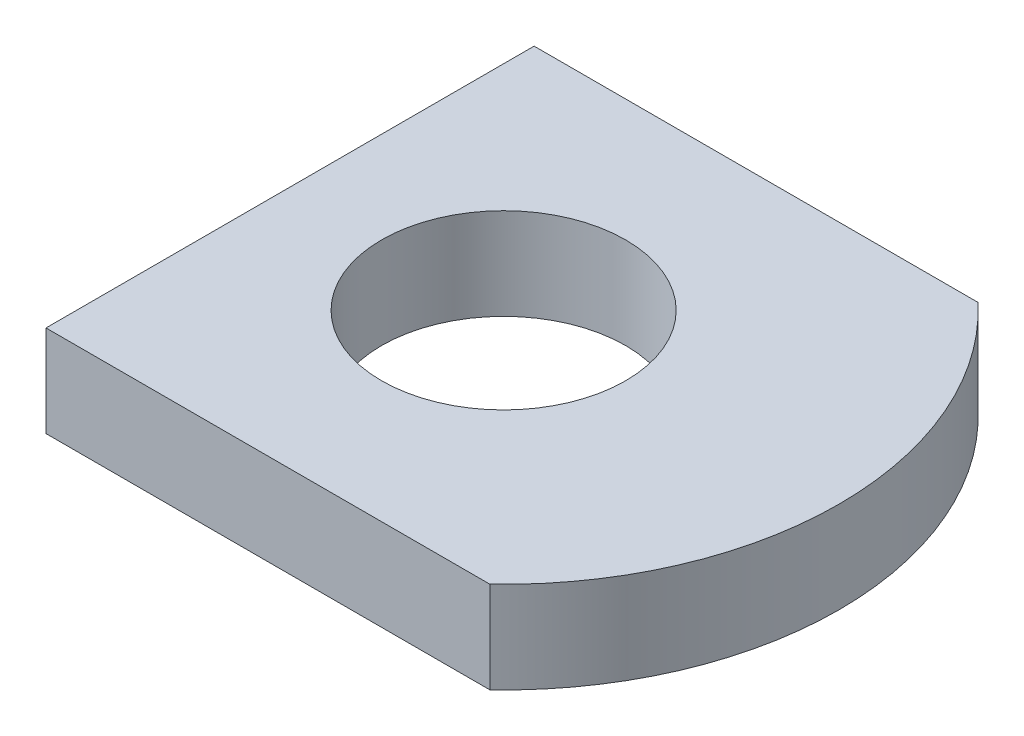
ISO-10303-21;
HEADER;
FILE_DESCRIPTION(('STEP AP214'),'2;1');
FILE_NAME('part.step','',(''),(''),'','','');
FILE_SCHEMA(('AUTOMOTIVE_DESIGN { 1 0 10303 214 1 1 1 1 }'));
ENDSEC;
DATA;
#1=APPLICATION_CONTEXT('core data for automotive mechanical design processes');
#2=APPLICATION_PROTOCOL_DEFINITION('international standard','automotive_design',2000,#1);
#3=PRODUCT_CONTEXT('',#1,'mechanical');
#4=PRODUCT('Part','Part','',(#3));
#5=PRODUCT_RELATED_PRODUCT_CATEGORY('part','',(#4));
#6=PRODUCT_DEFINITION_FORMATION('','',#4);
#7=PRODUCT_DEFINITION_CONTEXT('part definition',#1,'design');
#8=PRODUCT_DEFINITION('design','',#6,#7);
#9=PRODUCT_DEFINITION_SHAPE('','',#8);
#10=(LENGTH_UNIT() NAMED_UNIT(*) SI_UNIT(.MILLI.,.METRE.));
#11=(NAMED_UNIT(*) PLANE_ANGLE_UNIT() SI_UNIT($,.RADIAN.));
#12=(NAMED_UNIT(*) SI_UNIT($,.STERADIAN.) SOLID_ANGLE_UNIT());
#13=UNCERTAINTY_MEASURE_WITH_UNIT(LENGTH_MEASURE(1.E-05),#10,'distance_accuracy_value','');
#14=(GEOMETRIC_REPRESENTATION_CONTEXT(3) GLOBAL_UNCERTAINTY_ASSIGNED_CONTEXT((#13)) GLOBAL_UNIT_ASSIGNED_CONTEXT((#10,
#11,#12)) REPRESENTATION_CONTEXT('',''));
#15=CARTESIAN_POINT('',(0.,0.,0.));
#16=DIRECTION('',(0.,0.,1.));
#17=DIRECTION('',(1.,0.,0.));
#18=AXIS2_PLACEMENT_3D('',#15,#16,#17);
#19=CARTESIAN_POINT('',(7.,3.,-8.));
#20=DIRECTION('',(0.,1.,0.));
#21=DIRECTION('',(0.,0.,1.));
#22=AXIS2_PLACEMENT_3D('',#19,#20,#21);
#23=PLANE('',#22);
#24=DIRECTION('',(0.,0.,1.));
#25=VECTOR('',#24,1.);
#26=CARTESIAN_POINT('',(0.,3.,0.));
#27=LINE('',#26,#25);
#28=CARTESIAN_POINT('',(0.,3.,-16.));
#29=VERTEX_POINT('',#28);
#30=CARTESIAN_POINT('',(0.,3.,0.));
#31=VERTEX_POINT('',#30);
#32=EDGE_CURVE('E87',#29,#31,#27,.T.);
#33=ORIENTED_EDGE('',*,*,#32,.T.);
#34=DIRECTION('',(1.,0.,0.));
#35=VECTOR('',#34,1.);
#36=CARTESIAN_POINT('',(0.,3.,0.));
#37=LINE('',#36,#35);
#38=CARTESIAN_POINT('',(14.5498344352707,3.,0.));
#39=VERTEX_POINT('',#38);
#40=EDGE_CURVE('E82',#31,#39,#37,.T.);
#41=ORIENTED_EDGE('',*,*,#40,.T.);
#42=CARTESIAN_POINT('',(7.,3.,-8.));
#43=DIRECTION('',(0.,1.,0.));
#44=DIRECTION('',(0.,0.,1.));
#45=AXIS2_PLACEMENT_3D('',#42,#43,#44);
#46=CIRCLE('',#45,11.);
#47=CARTESIAN_POINT('',(14.5498344352707,3.,-16.));
#48=VERTEX_POINT('',#47);
#49=EDGE_CURVE('E85',#39,#48,#46,.T.);
#50=ORIENTED_EDGE('',*,*,#49,.T.);
#51=DIRECTION('',(-1.,0.,0.));
#52=VECTOR('',#51,1.);
#53=CARTESIAN_POINT('',(0.,3.,-16.));
#54=LINE('',#53,#52);
#55=EDGE_CURVE('E52',#48,#29,#54,.T.);
#56=ORIENTED_EDGE('',*,*,#55,.T.);
#57=EDGE_LOOP('',(#33,#41,#50,#56));
#58=FACE_BOUND('',#57,.T.);
#59=CARTESIAN_POINT('',(7.,3.,-8.));
#60=DIRECTION('',(0.,1.,0.));
#61=DIRECTION('',(0.,0.,1.));
#62=AXIS2_PLACEMENT_3D('',#59,#60,#61);
#63=CIRCLE('',#62,4.);
#64=CARTESIAN_POINT('',(7.,3.,-4.));
#65=VERTEX_POINT('',#64);
#66=EDGE_CURVE('E102',#65,#65,#63,.T.);
#67=ORIENTED_EDGE('',*,*,#66,.F.);
#68=EDGE_LOOP('',(#67));
#69=FACE_BOUND('',#68,.T.);
#70=ADVANCED_FACE('F35',(#58,#69),#23,.T.);
#71=CARTESIAN_POINT('',(7.,0.,-8.));
#72=DIRECTION('',(0.,1.,0.));
#73=DIRECTION('',(0.,0.,1.));
#74=AXIS2_PLACEMENT_3D('',#71,#72,#73);
#75=PLANE('',#74);
#76=DIRECTION('',(0.,0.,1.));
#77=VECTOR('',#76,1.);
#78=CARTESIAN_POINT('',(0.,0.,0.));
#79=LINE('',#78,#77);
#80=CARTESIAN_POINT('',(0.,0.,-16.));
#81=VERTEX_POINT('',#80);
#82=CARTESIAN_POINT('',(0.,0.,0.));
#83=VERTEX_POINT('',#82);
#84=EDGE_CURVE('E99',#81,#83,#79,.T.);
#85=ORIENTED_EDGE('',*,*,#84,.F.);
#86=DIRECTION('',(-1.,0.,0.));
#87=VECTOR('',#86,1.);
#88=CARTESIAN_POINT('',(0.,0.,-16.));
#89=LINE('',#88,#87);
#90=CARTESIAN_POINT('',(14.5498344352707,0.,-16.));
#91=VERTEX_POINT('',#90);
#92=EDGE_CURVE('E75',#91,#81,#89,.T.);
#93=ORIENTED_EDGE('',*,*,#92,.F.);
#94=CARTESIAN_POINT('',(7.,0.,-8.));
#95=DIRECTION('',(0.,1.,0.));
#96=DIRECTION('',(0.,0.,1.));
#97=AXIS2_PLACEMENT_3D('',#94,#95,#96);
#98=CIRCLE('',#97,11.);
#99=CARTESIAN_POINT('',(14.5498344352707,0.,0.));
#100=VERTEX_POINT('',#99);
#101=EDGE_CURVE('E69',#100,#91,#98,.T.);
#102=ORIENTED_EDGE('',*,*,#101,.F.);
#103=DIRECTION('',(1.,0.,0.));
#104=VECTOR('',#103,1.);
#105=CARTESIAN_POINT('',(0.,0.,0.));
#106=LINE('',#105,#104);
#107=EDGE_CURVE('E91',#83,#100,#106,.T.);
#108=ORIENTED_EDGE('',*,*,#107,.F.);
#109=EDGE_LOOP('',(#85,#93,#102,#108));
#110=FACE_BOUND('',#109,.T.);
#111=CARTESIAN_POINT('',(7.,0.,-8.));
#112=DIRECTION('',(0.,1.,0.));
#113=DIRECTION('',(0.,0.,1.));
#114=AXIS2_PLACEMENT_3D('',#111,#112,#113);
#115=CIRCLE('',#114,4.);
#116=CARTESIAN_POINT('',(7.,0.,-4.));
#117=VERTEX_POINT('',#116);
#118=EDGE_CURVE('E114',#117,#117,#115,.T.);
#119=ORIENTED_EDGE('',*,*,#118,.T.);
#120=EDGE_LOOP('',(#119));
#121=FACE_BOUND('',#120,.T.);
#122=ADVANCED_FACE('F110',(#110,#121),#75,.F.);
#123=CARTESIAN_POINT('',(0.,3.,0.));
#124=DIRECTION('',(1.,0.,0.));
#125=DIRECTION('',(0.,0.,-1.));
#126=AXIS2_PLACEMENT_3D('',#123,#124,#125);
#127=PLANE('',#126);
#128=ORIENTED_EDGE('',*,*,#84,.T.);
#129=DIRECTION('',(0.,-1.,0.));
#130=VECTOR('',#129,1.);
#131=CARTESIAN_POINT('',(0.,3.,0.));
#132=LINE('',#131,#130);
#133=EDGE_CURVE('E11',#31,#83,#132,.T.);
#134=ORIENTED_EDGE('',*,*,#133,.F.);
#135=ORIENTED_EDGE('',*,*,#32,.F.);
#136=DIRECTION('',(0.,-1.,0.));
#137=VECTOR('',#136,1.);
#138=CARTESIAN_POINT('',(0.,3.,-16.));
#139=LINE('',#138,#137);
#140=EDGE_CURVE('E95',#29,#81,#139,.T.);
#141=ORIENTED_EDGE('',*,*,#140,.T.);
#142=EDGE_LOOP('',(#128,#134,#135,#141));
#143=FACE_BOUND('',#142,.T.);
#144=ADVANCED_FACE('F37',(#143),#127,.F.);
#145=CARTESIAN_POINT('',(0.,3.,0.));
#146=DIRECTION('',(0.,0.,-1.));
#147=DIRECTION('',(-1.,0.,0.));
#148=AXIS2_PLACEMENT_3D('',#145,#146,#147);
#149=PLANE('',#148);
#150=ORIENTED_EDGE('',*,*,#107,.T.);
#151=DIRECTION('',(0.,-1.,0.));
#152=VECTOR('',#151,1.);
#153=CARTESIAN_POINT('',(14.5498344352707,3.,0.));
#154=LINE('',#153,#152);
#155=EDGE_CURVE('E44',#39,#100,#154,.T.);
#156=ORIENTED_EDGE('',*,*,#155,.F.);
#157=ORIENTED_EDGE('',*,*,#40,.F.);
#158=ORIENTED_EDGE('',*,*,#133,.T.);
#159=EDGE_LOOP('',(#150,#156,#157,#158));
#160=FACE_BOUND('',#159,.T.);
#161=ADVANCED_FACE('F90',(#160),#149,.F.);
#162=CARTESIAN_POINT('',(7.,3.,-8.));
#163=DIRECTION('',(0.,-1.,0.));
#164=DIRECTION('',(0.,0.,-1.));
#165=AXIS2_PLACEMENT_3D('',#162,#163,#164);
#166=CYLINDRICAL_SURFACE('',#165,11.);
#167=ORIENTED_EDGE('',*,*,#101,.T.);
#168=DIRECTION('',(0.,-1.,0.));
#169=VECTOR('',#168,1.);
#170=CARTESIAN_POINT('',(14.5498344352707,3.,-16.));
#171=LINE('',#170,#169);
#172=EDGE_CURVE('E92',#48,#91,#171,.T.);
#173=ORIENTED_EDGE('',*,*,#172,.F.);
#174=ORIENTED_EDGE('',*,*,#49,.F.);
#175=ORIENTED_EDGE('',*,*,#155,.T.);
#176=EDGE_LOOP('',(#167,#173,#174,#175));
#177=FACE_BOUND('',#176,.T.);
#178=ADVANCED_FACE('F93',(#177),#166,.T.);
#179=CARTESIAN_POINT('',(0.,3.,-16.));
#180=DIRECTION('',(0.,0.,1.));
#181=DIRECTION('',(1.,0.,0.));
#182=AXIS2_PLACEMENT_3D('',#179,#180,#181);
#183=PLANE('',#182);
#184=ORIENTED_EDGE('',*,*,#92,.T.);
#185=ORIENTED_EDGE('',*,*,#140,.F.);
#186=ORIENTED_EDGE('',*,*,#55,.F.);
#187=ORIENTED_EDGE('',*,*,#172,.T.);
#188=EDGE_LOOP('',(#184,#185,#186,#187));
#189=FACE_BOUND('',#188,.T.);
#190=ADVANCED_FACE('F107',(#189),#183,.F.);
#191=CARTESIAN_POINT('',(7.,3.,-8.));
#192=DIRECTION('',(0.,-1.,0.));
#193=DIRECTION('',(0.,0.,-1.));
#194=AXIS2_PLACEMENT_3D('',#191,#192,#193);
#195=CYLINDRICAL_SURFACE('',#194,4.);
#196=ORIENTED_EDGE('',*,*,#66,.T.);
#197=EDGE_LOOP('',(#196));
#198=FACE_BOUND('',#197,.T.);
#199=ORIENTED_EDGE('',*,*,#118,.F.);
#200=EDGE_LOOP('',(#199));
#201=FACE_BOUND('',#200,.T.);
#202=ADVANCED_FACE('F120',(#198,#201),#195,.F.);
#203=CLOSED_SHELL('',(#70,#122,#144,#161,#178,#190,#202));
#204=MANIFOLD_SOLID_BREP('B2',#203);
#205=ADVANCED_BREP_SHAPE_REPRESENTATION('',(#18,#204),#14);
#206=SHAPE_DEFINITION_REPRESENTATION(#9,#205);
ENDSEC;
END-ISO-10303-21;
